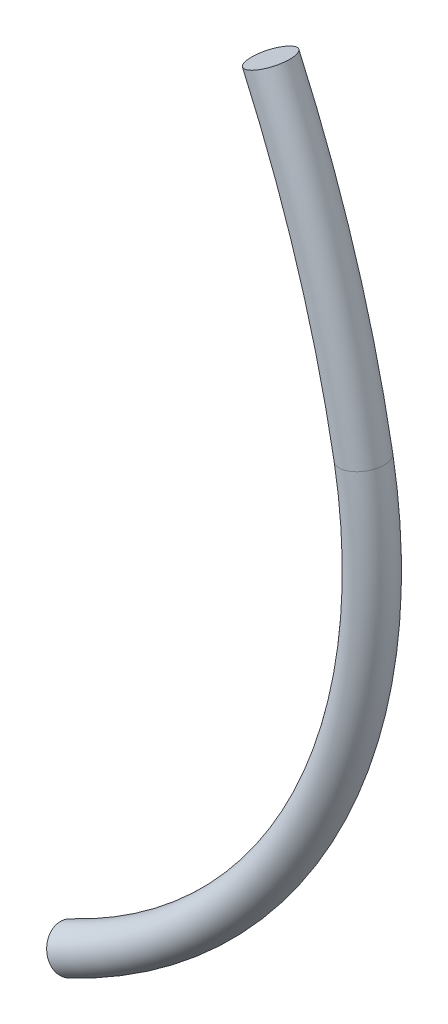
ISO-10303-21;
HEADER;
FILE_DESCRIPTION(('STEP AP214'),'2;1');
FILE_NAME('part.step','',(''),(''),'','','');
FILE_SCHEMA(('AUTOMOTIVE_DESIGN { 1 0 10303 214 1 1 1 1 }'));
ENDSEC;
DATA;
#1=APPLICATION_CONTEXT('core data for automotive mechanical design processes');
#2=APPLICATION_PROTOCOL_DEFINITION('international standard','automotive_design',2000,#1);
#3=PRODUCT_CONTEXT('',#1,'mechanical');
#4=PRODUCT('Part','Part','',(#3));
#5=PRODUCT_RELATED_PRODUCT_CATEGORY('part','',(#4));
#6=PRODUCT_DEFINITION_FORMATION('','',#4);
#7=PRODUCT_DEFINITION_CONTEXT('part definition',#1,'design');
#8=PRODUCT_DEFINITION('design','',#6,#7);
#9=PRODUCT_DEFINITION_SHAPE('','',#8);
#10=(LENGTH_UNIT() NAMED_UNIT(*) SI_UNIT(.MILLI.,.METRE.));
#11=(NAMED_UNIT(*) PLANE_ANGLE_UNIT() SI_UNIT($,.RADIAN.));
#12=(NAMED_UNIT(*) SI_UNIT($,.STERADIAN.) SOLID_ANGLE_UNIT());
#13=UNCERTAINTY_MEASURE_WITH_UNIT(LENGTH_MEASURE(1.E-05),#10,'distance_accuracy_value','');
#14=(GEOMETRIC_REPRESENTATION_CONTEXT(3) GLOBAL_UNCERTAINTY_ASSIGNED_CONTEXT((#13)) GLOBAL_UNIT_ASSIGNED_CONTEXT((#10,
#11,#12)) REPRESENTATION_CONTEXT('',''));
#15=CARTESIAN_POINT('',(0.,0.,0.));
#16=DIRECTION('',(0.,0.,1.));
#17=DIRECTION('',(1.,0.,0.));
#18=AXIS2_PLACEMENT_3D('',#15,#16,#17);
#19=CARTESIAN_POINT('',(1257.70114343993,-2360.27400555247,0.));
#20=DIRECTION('',(0.,0.,1.));
#21=DIRECTION('',(1.,0.,0.));
#22=AXIS2_PLACEMENT_3D('',#19,#20,#21);
#23=TOROIDAL_SURFACE('',#22,3128.88744986843,50.7999999999999);
#24=CARTESIAN_POINT('',(4336.74297038177,-1804.00239753457,0.));
#25=DIRECTION('',(-0.177785751942367,0.984069218300363,0.));
#26=DIRECTION('',(-0.984069218300363,-0.177785751942367,0.));
#27=AXIS2_PLACEMENT_3D('',#24,#25,#26);
#28=CIRCLE('',#27,50.7999999999999);
#29=CARTESIAN_POINT('',(4386.73368667143,-1794.9708813359,0.));
#30=VERTEX_POINT('',#29);
#31=EDGE_CURVE('E41',#30,#30,#28,.T.);
#32=CARTESIAN_POINT('',(4111.7463897158,-1077.9470557638,0.));
#33=DIRECTION('',(-0.409834796020734,0.912159766691473,0.));
#34=DIRECTION('',(-0.912159766691473,-0.409834796020734,0.));
#35=AXIS2_PLACEMENT_3D('',#32,#33,#34);
#36=CIRCLE('',#35,50.7999999999999);
#37=CARTESIAN_POINT('',(4158.08410586372,-1057.12744812595,0.));
#38=VERTEX_POINT('',#37);
#39=EDGE_CURVE('E10',#38,#38,#36,.T.);
#40=CARTESIAN_POINT('',(1257.70114343993,-2360.27400555247,0.));
#41=DIRECTION('',(0.,0.,1.));
#42=DIRECTION('',(1.,0.,0.));
#43=AXIS2_PLACEMENT_3D('',#40,#41,#42);
#44=CIRCLE('',#43,3179.68744986843);
#45=EDGE_CURVE('',#30,#38,#44,.T.);
#46=ORIENTED_EDGE('',*,*,#31,.T.);
#47=ORIENTED_EDGE('',*,*,#39,.F.);
#48=ORIENTED_EDGE('',*,*,#45,.T.);
#49=ORIENTED_EDGE('',*,*,#45,.F.);
#50=EDGE_LOOP('',(#46,#48,#47,#49));
#51=FACE_BOUND('',#50,.T.);
#52=ADVANCED_FACE('F35',(#51),#23,.T.);
#53=CARTESIAN_POINT('',(3074.38147036577,-2032.06550969153,0.));
#54=DIRECTION('',(0.,0.,-1.));
#55=DIRECTION('',(-1.,0.,0.));
#56=AXIS2_PLACEMENT_3D('',#53,#54,#55);
#57=TOROIDAL_SURFACE('',#56,1282.79746641837,50.7999999999999);
#58=CARTESIAN_POINT('',(3623.90816121548,-3191.19870130202,0.));
#59=DIRECTION('',(0.90359797392402,0.428381490637033,0.));
#60=DIRECTION('',(-0.428381490637033,0.90359797392402,0.));
#61=AXIS2_PLACEMENT_3D('',#58,#59,#60);
#62=CIRCLE('',#61,50.7999999999999);
#63=CARTESIAN_POINT('',(3645.66994093984,-3237.10147837737,0.));
#64=VERTEX_POINT('',#63);
#65=EDGE_CURVE('E45',#64,#64,#62,.T.);
#66=CARTESIAN_POINT('',(3074.38147036577,-2032.06550969153,0.));
#67=DIRECTION('',(0.,0.,-1.));
#68=DIRECTION('',(-1.,0.,0.));
#69=AXIS2_PLACEMENT_3D('',#66,#67,#68);
#70=CIRCLE('',#69,1333.59746641837);
#71=EDGE_CURVE('',#30,#64,#70,.T.);
#72=ORIENTED_EDGE('',*,*,#31,.F.);
#73=ORIENTED_EDGE('',*,*,#65,.T.);
#74=ORIENTED_EDGE('',*,*,#71,.T.);
#75=ORIENTED_EDGE('',*,*,#71,.F.);
#76=EDGE_LOOP('',(#72,#74,#73,#75));
#77=FACE_BOUND('',#76,.T.);
#78=ADVANCED_FACE('F52',(#77),#57,.T.);
#79=CARTESIAN_POINT('',(4111.7463897158,-1077.9470557638,0.));
#80=DIRECTION('',(-0.409834796020734,0.912159766691473,0.));
#81=DIRECTION('',(-0.912159766691473,-0.409834796020734,0.));
#82=AXIS2_PLACEMENT_3D('',#79,#80,#81);
#83=PLANE('',#82);
#84=ORIENTED_EDGE('',*,*,#39,.T.);
#85=EDGE_LOOP('',(#84));
#86=FACE_BOUND('',#85,.T.);
#87=ADVANCED_FACE('F56',(#86),#83,.T.);
#88=CARTESIAN_POINT('',(3623.90816121548,-3191.19870130202,0.));
#89=DIRECTION('',(0.90359797392402,0.428381490637033,0.));
#90=DIRECTION('',(-0.428381490637033,0.90359797392402,0.));
#91=AXIS2_PLACEMENT_3D('',#88,#89,#90);
#92=PLANE('',#91);
#93=ORIENTED_EDGE('',*,*,#65,.F.);
#94=EDGE_LOOP('',(#93));
#95=FACE_BOUND('',#94,.T.);
#96=ADVANCED_FACE('F54',(#95),#92,.F.);
#97=CLOSED_SHELL('',(#52,#78,#87,#96));
#98=MANIFOLD_SOLID_BREP('B2',#97);
#99=ADVANCED_BREP_SHAPE_REPRESENTATION('',(#18,#98),#14);
#100=SHAPE_DEFINITION_REPRESENTATION(#9,#99);
ENDSEC;
END-ISO-10303-21;
